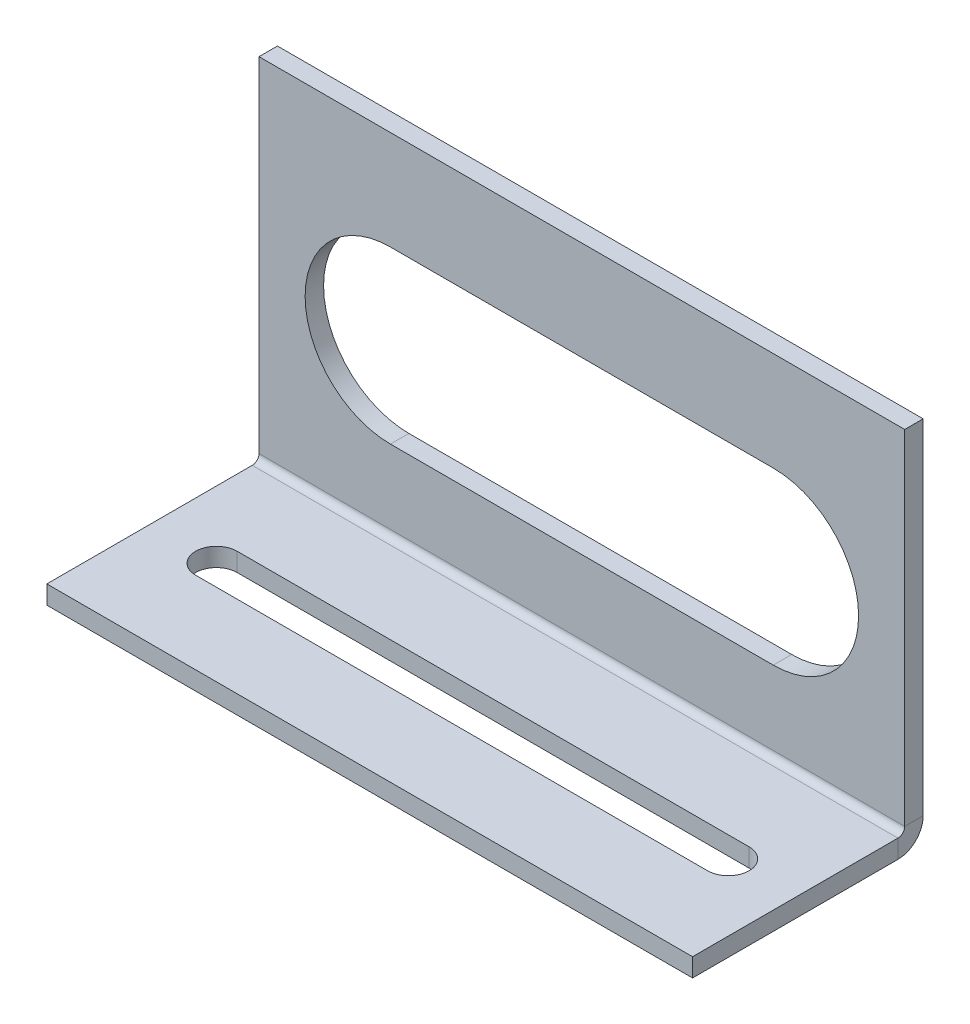
ISO-10303-21;
HEADER;
FILE_DESCRIPTION(('STEP AP214'),'2;1');
FILE_NAME('part.step','',(''),(''),'','','');
FILE_SCHEMA(('AUTOMOTIVE_DESIGN { 1 0 10303 214 1 1 1 1 }'));
ENDSEC;
DATA;
#1=APPLICATION_CONTEXT('core data for automotive mechanical design processes');
#2=APPLICATION_PROTOCOL_DEFINITION('international standard','automotive_design',2000,#1);
#3=PRODUCT_CONTEXT('',#1,'mechanical');
#4=PRODUCT('Part','Part','',(#3));
#5=PRODUCT_RELATED_PRODUCT_CATEGORY('part','',(#4));
#6=PRODUCT_DEFINITION_FORMATION('','',#4);
#7=PRODUCT_DEFINITION_CONTEXT('part definition',#1,'design');
#8=PRODUCT_DEFINITION('design','',#6,#7);
#9=PRODUCT_DEFINITION_SHAPE('','',#8);
#10=(LENGTH_UNIT() NAMED_UNIT(*) SI_UNIT(.MILLI.,.METRE.));
#11=(NAMED_UNIT(*) PLANE_ANGLE_UNIT() SI_UNIT($,.RADIAN.));
#12=(NAMED_UNIT(*) SI_UNIT($,.STERADIAN.) SOLID_ANGLE_UNIT());
#13=UNCERTAINTY_MEASURE_WITH_UNIT(LENGTH_MEASURE(1.E-05),#10,'distance_accuracy_value','');
#14=(GEOMETRIC_REPRESENTATION_CONTEXT(3) GLOBAL_UNCERTAINTY_ASSIGNED_CONTEXT((#13)) GLOBAL_UNIT_ASSIGNED_CONTEXT((#10,
#11,#12)) REPRESENTATION_CONTEXT('',''));
#15=CARTESIAN_POINT('',(0.,0.,0.));
#16=DIRECTION('',(0.,0.,1.));
#17=DIRECTION('',(1.,0.,0.));
#18=AXIS2_PLACEMENT_3D('',#15,#16,#17);
#19=CARTESIAN_POINT('',(0.,-18.,0.));
#20=DIRECTION('',(0.,1.,0.));
#21=DIRECTION('',(0.,0.,1.));
#22=AXIS2_PLACEMENT_3D('',#19,#20,#21);
#23=PLANE('',#22);
#24=DIRECTION('',(0.,0.,-1.));
#25=VECTOR('',#24,1.);
#26=CARTESIAN_POINT('',(35.,-18.0000000000001,23.));
#27=LINE('',#26,#25);
#28=CARTESIAN_POINT('',(35.,-18.,0.736599999999997));
#29=VERTEX_POINT('',#28);
#30=CARTESIAN_POINT('',(35.,-18.0000000000001,23.));
#31=VERTEX_POINT('',#30);
#32=EDGE_CURVE('E398',#29,#31,#27,.F.);
#33=ORIENTED_EDGE('',*,*,#32,.F.);
#34=DIRECTION('',(1.,0.,0.));
#35=VECTOR('',#34,1.);
#36=CARTESIAN_POINT('',(-35.,-18.,0.736599999999997));
#37=LINE('',#36,#35);
#38=CARTESIAN_POINT('',(-35.,-18.,0.736599999999997));
#39=VERTEX_POINT('',#38);
#40=EDGE_CURVE('E408',#39,#29,#37,.T.);
#41=ORIENTED_EDGE('',*,*,#40,.F.);
#42=DIRECTION('',(0.,0.,1.));
#43=VECTOR('',#42,1.);
#44=CARTESIAN_POINT('',(-35.,-18.,0.));
#45=LINE('',#44,#43);
#46=CARTESIAN_POINT('',(-35.,-18.0000000000001,23.));
#47=VERTEX_POINT('',#46);
#48=EDGE_CURVE('E400',#47,#39,#45,.F.);
#49=ORIENTED_EDGE('',*,*,#48,.F.);
#50=DIRECTION('',(1.,0.,0.));
#51=VECTOR('',#50,1.);
#52=CARTESIAN_POINT('',(-35.,-18.0000000000001,23.));
#53=LINE('',#52,#51);
#54=EDGE_CURVE('E396',#31,#47,#53,.F.);
#55=ORIENTED_EDGE('',*,*,#54,.F.);
#56=EDGE_LOOP('',(#33,#41,#49,#55));
#57=FACE_BOUND('',#56,.T.);
#58=CARTESIAN_POINT('',(-27.75,-18.,11.8683));
#59=DIRECTION('',(0.,1.,0.));
#60=DIRECTION('',(0.,0.,1.));
#61=AXIS2_PLACEMENT_3D('',#58,#59,#60);
#62=CIRCLE('',#61,2.25);
#63=CARTESIAN_POINT('',(-27.75,-18.,9.6183));
#64=VERTEX_POINT('',#63);
#65=CARTESIAN_POINT('',(-27.75,-18.,14.1183));
#66=VERTEX_POINT('',#65);
#67=EDGE_CURVE('E228',#64,#66,#62,.T.);
#68=ORIENTED_EDGE('',*,*,#67,.F.);
#69=DIRECTION('',(1.,0.,0.));
#70=VECTOR('',#69,1.);
#71=CARTESIAN_POINT('',(-27.75,-18.,9.6183));
#72=LINE('',#71,#70);
#73=CARTESIAN_POINT('',(27.75,-18.,9.6183));
#74=VERTEX_POINT('',#73);
#75=EDGE_CURVE('E318',#64,#74,#72,.T.);
#76=ORIENTED_EDGE('',*,*,#75,.T.);
#77=CARTESIAN_POINT('',(27.75,-18.,11.8683));
#78=DIRECTION('',(0.,1.,0.));
#79=DIRECTION('',(0.,0.,1.));
#80=AXIS2_PLACEMENT_3D('',#77,#78,#79);
#81=CIRCLE('',#80,2.25);
#82=CARTESIAN_POINT('',(27.75,-18.,14.1183));
#83=VERTEX_POINT('',#82);
#84=EDGE_CURVE('E333',#83,#74,#81,.T.);
#85=ORIENTED_EDGE('',*,*,#84,.F.);
#86=DIRECTION('',(1.,0.,0.));
#87=VECTOR('',#86,1.);
#88=CARTESIAN_POINT('',(-27.75,-18.,14.1183));
#89=LINE('',#88,#87);
#90=EDGE_CURVE('E337',#66,#83,#89,.T.);
#91=ORIENTED_EDGE('',*,*,#90,.F.);
#92=EDGE_LOOP('',(#68,#76,#85,#91));
#93=FACE_BOUND('',#92,.T.);
#94=ADVANCED_FACE('F205',(#57,#93),#23,.T.);
#95=CARTESIAN_POINT('',(35.,-20.,-2.));
#96=DIRECTION('',(1.,0.,0.));
#97=DIRECTION('',(0.,0.,-1.));
#98=AXIS2_PLACEMENT_3D('',#95,#96,#97);
#99=PLANE('',#98);
#100=DIRECTION('',(0.,1.,0.));
#101=VECTOR('',#100,1.);
#102=CARTESIAN_POINT('',(35.,-20.,0.));
#103=LINE('',#102,#101);
#104=CARTESIAN_POINT('',(35.,-17.2634,0.));
#105=VERTEX_POINT('',#104);
#106=CARTESIAN_POINT('',(35.,20.,0.));
#107=VERTEX_POINT('',#106);
#108=EDGE_CURVE('E432',#105,#107,#103,.T.);
#109=ORIENTED_EDGE('',*,*,#108,.F.);
#110=DIRECTION('',(0.,0.,-1.));
#111=VECTOR('',#110,1.);
#112=CARTESIAN_POINT('',(35.,-17.2634,0.));
#113=LINE('',#112,#111);
#114=CARTESIAN_POINT('',(35.,-17.2634,-2.));
#115=VERTEX_POINT('',#114);
#116=EDGE_CURVE('E419',#105,#115,#113,.T.);
#117=ORIENTED_EDGE('',*,*,#116,.T.);
#118=DIRECTION('',(0.,1.,0.));
#119=VECTOR('',#118,1.);
#120=CARTESIAN_POINT('',(35.,-20.,-2.));
#121=LINE('',#120,#119);
#122=CARTESIAN_POINT('',(35.,20.,-2.));
#123=VERTEX_POINT('',#122);
#124=EDGE_CURVE('E435',#115,#123,#121,.T.);
#125=ORIENTED_EDGE('',*,*,#124,.T.);
#126=DIRECTION('',(0.,0.,1.));
#127=VECTOR('',#126,1.);
#128=CARTESIAN_POINT('',(35.,20.,-2.));
#129=LINE('',#128,#127);
#130=EDGE_CURVE('E209',#123,#107,#129,.T.);
#131=ORIENTED_EDGE('',*,*,#130,.T.);
#132=EDGE_LOOP('',(#109,#117,#125,#131));
#133=FACE_BOUND('',#132,.T.);
#134=ADVANCED_FACE('F207',(#133),#99,.T.);
#135=CARTESIAN_POINT('',(0.,0.,-2.));
#136=DIRECTION('',(0.,0.,-1.));
#137=DIRECTION('',(-1.,0.,0.));
#138=AXIS2_PLACEMENT_3D('',#135,#136,#137);
#139=PLANE('',#138);
#140=CARTESIAN_POINT('',(-20.75,0.,-2.));
#141=DIRECTION('',(0.,0.,1.));
#142=DIRECTION('',(1.,0.,0.));
#143=AXIS2_PLACEMENT_3D('',#140,#141,#142);
#144=CIRCLE('',#143,9.25);
#145=CARTESIAN_POINT('',(-20.75,9.24999999999999,-2.));
#146=VERTEX_POINT('',#145);
#147=CARTESIAN_POINT('',(-20.75,-9.25,-2.));
#148=VERTEX_POINT('',#147);
#149=EDGE_CURVE('E361',#146,#148,#144,.T.);
#150=ORIENTED_EDGE('',*,*,#149,.T.);
#151=DIRECTION('',(1.,0.,0.));
#152=VECTOR('',#151,1.);
#153=CARTESIAN_POINT('',(-20.75,-9.25,-2.));
#154=LINE('',#153,#152);
#155=CARTESIAN_POINT('',(20.75,-9.25,-2.));
#156=VERTEX_POINT('',#155);
#157=EDGE_CURVE('E351',#148,#156,#154,.T.);
#158=ORIENTED_EDGE('',*,*,#157,.T.);
#159=CARTESIAN_POINT('',(20.75,0.,-2.));
#160=DIRECTION('',(0.,0.,1.));
#161=DIRECTION('',(1.,0.,0.));
#162=AXIS2_PLACEMENT_3D('',#159,#160,#161);
#163=CIRCLE('',#162,9.25);
#164=CARTESIAN_POINT('',(20.75,9.25,-2.));
#165=VERTEX_POINT('',#164);
#166=EDGE_CURVE('E373',#156,#165,#163,.T.);
#167=ORIENTED_EDGE('',*,*,#166,.T.);
#168=DIRECTION('',(1.,0.,0.));
#169=VECTOR('',#168,1.);
#170=CARTESIAN_POINT('',(-20.75,9.24999999999999,-2.));
#171=LINE('',#170,#169);
#172=EDGE_CURVE('E354',#146,#165,#171,.T.);
#173=ORIENTED_EDGE('',*,*,#172,.F.);
#174=EDGE_LOOP('',(#150,#158,#167,#173));
#175=FACE_BOUND('',#174,.T.);
#176=ORIENTED_EDGE('',*,*,#124,.F.);
#177=DIRECTION('',(1.,0.,0.));
#178=VECTOR('',#177,1.);
#179=CARTESIAN_POINT('',(35.,-17.2634,-2.));
#180=LINE('',#179,#178);
#181=CARTESIAN_POINT('',(-35.,-17.2634,-2.));
#182=VERTEX_POINT('',#181);
#183=EDGE_CURVE('E412',#115,#182,#180,.F.);
#184=ORIENTED_EDGE('',*,*,#183,.T.);
#185=DIRECTION('',(0.,-1.,0.));
#186=VECTOR('',#185,1.);
#187=CARTESIAN_POINT('',(-35.,-20.,-2.));
#188=LINE('',#187,#186);
#189=CARTESIAN_POINT('',(-35.,20.,-2.));
#190=VERTEX_POINT('',#189);
#191=EDGE_CURVE('E441',#190,#182,#188,.T.);
#192=ORIENTED_EDGE('',*,*,#191,.F.);
#193=DIRECTION('',(-1.,0.,0.));
#194=VECTOR('',#193,1.);
#195=CARTESIAN_POINT('',(-35.,20.,-2.));
#196=LINE('',#195,#194);
#197=EDGE_CURVE('E437',#123,#190,#196,.T.);
#198=ORIENTED_EDGE('',*,*,#197,.F.);
#199=EDGE_LOOP('',(#176,#184,#192,#198));
#200=FACE_BOUND('',#199,.T.);
#201=ADVANCED_FACE('F464',(#175,#200),#139,.T.);
#202=CARTESIAN_POINT('',(0.,0.,0.));
#203=DIRECTION('',(0.,0.,-1.));
#204=DIRECTION('',(-1.,0.,0.));
#205=AXIS2_PLACEMENT_3D('',#202,#203,#204);
#206=PLANE('',#205);
#207=CARTESIAN_POINT('',(-20.75,0.,0.));
#208=DIRECTION('',(0.,0.,1.));
#209=DIRECTION('',(1.,0.,0.));
#210=AXIS2_PLACEMENT_3D('',#207,#208,#209);
#211=CIRCLE('',#210,9.24999999999999);
#212=CARTESIAN_POINT('',(-20.75,9.24999999999998,0.));
#213=VERTEX_POINT('',#212);
#214=CARTESIAN_POINT('',(-20.75,-9.25,0.));
#215=VERTEX_POINT('',#214);
#216=EDGE_CURVE('E359',#213,#215,#211,.T.);
#217=ORIENTED_EDGE('',*,*,#216,.F.);
#218=DIRECTION('',(1.,0.,0.));
#219=VECTOR('',#218,1.);
#220=CARTESIAN_POINT('',(-20.75,9.24999999999998,0.));
#221=LINE('',#220,#219);
#222=CARTESIAN_POINT('',(20.75,9.24999999999999,0.));
#223=VERTEX_POINT('',#222);
#224=EDGE_CURVE('E356',#213,#223,#221,.T.);
#225=ORIENTED_EDGE('',*,*,#224,.T.);
#226=CARTESIAN_POINT('',(20.75,0.,0.));
#227=DIRECTION('',(0.,0.,1.));
#228=DIRECTION('',(1.,0.,0.));
#229=AXIS2_PLACEMENT_3D('',#226,#227,#228);
#230=CIRCLE('',#229,9.24999999999999);
#231=CARTESIAN_POINT('',(20.75,-9.25000000000004,0.));
#232=VERTEX_POINT('',#231);
#233=EDGE_CURVE('E370',#232,#223,#230,.T.);
#234=ORIENTED_EDGE('',*,*,#233,.F.);
#235=DIRECTION('',(1.,0.,0.));
#236=VECTOR('',#235,1.);
#237=CARTESIAN_POINT('',(-20.75,-9.25000000000004,0.));
#238=LINE('',#237,#236);
#239=EDGE_CURVE('E349',#215,#232,#238,.T.);
#240=ORIENTED_EDGE('',*,*,#239,.F.);
#241=EDGE_LOOP('',(#217,#225,#234,#240));
#242=FACE_BOUND('',#241,.T.);
#243=DIRECTION('',(1.,0.,0.));
#244=VECTOR('',#243,1.);
#245=CARTESIAN_POINT('',(35.,-17.2634,0.));
#246=LINE('',#245,#244);
#247=CARTESIAN_POINT('',(-35.,-17.2634,0.));
#248=VERTEX_POINT('',#247);
#249=EDGE_CURVE('E425',#105,#248,#246,.F.);
#250=ORIENTED_EDGE('',*,*,#249,.F.);
#251=ORIENTED_EDGE('',*,*,#108,.T.);
#252=DIRECTION('',(-1.,0.,0.));
#253=VECTOR('',#252,1.);
#254=CARTESIAN_POINT('',(-35.,20.,0.));
#255=LINE('',#254,#253);
#256=CARTESIAN_POINT('',(-35.,20.,0.));
#257=VERTEX_POINT('',#256);
#258=EDGE_CURVE('E445',#107,#257,#255,.T.);
#259=ORIENTED_EDGE('',*,*,#258,.T.);
#260=DIRECTION('',(0.,-1.,0.));
#261=VECTOR('',#260,1.);
#262=CARTESIAN_POINT('',(-35.,-20.,0.));
#263=LINE('',#262,#261);
#264=EDGE_CURVE('E438',#257,#248,#263,.T.);
#265=ORIENTED_EDGE('',*,*,#264,.T.);
#266=EDGE_LOOP('',(#250,#251,#259,#265));
#267=FACE_BOUND('',#266,.T.);
#268=ADVANCED_FACE('F453',(#242,#267),#206,.F.);
#269=CARTESIAN_POINT('',(-35.,-20.,-2.));
#270=DIRECTION('',(-1.,0.,0.));
#271=DIRECTION('',(0.,0.,1.));
#272=AXIS2_PLACEMENT_3D('',#269,#270,#271);
#273=PLANE('',#272);
#274=DIRECTION('',(0.,0.,-1.));
#275=VECTOR('',#274,1.);
#276=CARTESIAN_POINT('',(-35.,-17.2634,0.));
#277=LINE('',#276,#275);
#278=EDGE_CURVE('E429',#248,#182,#277,.T.);
#279=ORIENTED_EDGE('',*,*,#278,.F.);
#280=ORIENTED_EDGE('',*,*,#264,.F.);
#281=DIRECTION('',(0.,0.,1.));
#282=VECTOR('',#281,1.);
#283=CARTESIAN_POINT('',(-35.,20.,-2.));
#284=LINE('',#283,#282);
#285=EDGE_CURVE('E14',#190,#257,#284,.T.);
#286=ORIENTED_EDGE('',*,*,#285,.F.);
#287=ORIENTED_EDGE('',*,*,#191,.T.);
#288=EDGE_LOOP('',(#279,#280,#286,#287));
#289=FACE_BOUND('',#288,.T.);
#290=ADVANCED_FACE('F457',(#289),#273,.T.);
#291=CARTESIAN_POINT('',(-35.,20.,-2.));
#292=DIRECTION('',(0.,1.,0.));
#293=DIRECTION('',(0.,0.,1.));
#294=AXIS2_PLACEMENT_3D('',#291,#292,#293);
#295=PLANE('',#294);
#296=ORIENTED_EDGE('',*,*,#258,.F.);
#297=ORIENTED_EDGE('',*,*,#130,.F.);
#298=ORIENTED_EDGE('',*,*,#197,.T.);
#299=ORIENTED_EDGE('',*,*,#285,.T.);
#300=EDGE_LOOP('',(#296,#297,#298,#299));
#301=FACE_BOUND('',#300,.T.);
#302=ADVANCED_FACE('F477',(#301),#295,.T.);
#303=CARTESIAN_POINT('',(-35.,-17.2634,0.7366));
#304=DIRECTION('',(-1.,0.,0.));
#305=DIRECTION('',(0.,0.,1.));
#306=AXIS2_PLACEMENT_3D('',#303,#304,#305);
#307=PLANE('',#306);
#308=DIRECTION('',(0.,1.,0.));
#309=VECTOR('',#308,1.);
#310=CARTESIAN_POINT('',(-35.,-20.,0.73659999999999));
#311=LINE('',#310,#309);
#312=CARTESIAN_POINT('',(-35.,-20.,0.73659999999999));
#313=VERTEX_POINT('',#312);
#314=EDGE_CURVE('E381',#39,#313,#311,.F.);
#315=ORIENTED_EDGE('',*,*,#314,.F.);
#316=CARTESIAN_POINT('',(-35.,-17.2634,0.7366));
#317=DIRECTION('',(1.,0.,0.));
#318=DIRECTION('',(0.,0.,-1.));
#319=AXIS2_PLACEMENT_3D('',#316,#317,#318);
#320=CIRCLE('',#319,0.7366);
#321=EDGE_CURVE('E422',#248,#39,#320,.F.);
#322=ORIENTED_EDGE('',*,*,#321,.F.);
#323=ORIENTED_EDGE('',*,*,#278,.T.);
#324=CARTESIAN_POINT('',(-35.,-17.2634,0.7366));
#325=DIRECTION('',(1.,0.,0.));
#326=DIRECTION('',(0.,0.,-1.));
#327=AXIS2_PLACEMENT_3D('',#324,#325,#326);
#328=CIRCLE('',#327,2.7366);
#329=EDGE_CURVE('E415',#182,#313,#328,.F.);
#330=ORIENTED_EDGE('',*,*,#329,.T.);
#331=EDGE_LOOP('',(#315,#322,#323,#330));
#332=FACE_BOUND('',#331,.T.);
#333=ADVANCED_FACE('F461',(#332),#307,.T.);
#334=CARTESIAN_POINT('',(35.,-17.2634,0.7366));
#335=DIRECTION('',(-1.,0.,0.));
#336=DIRECTION('',(0.,0.,1.));
#337=AXIS2_PLACEMENT_3D('',#334,#335,#336);
#338=PLANE('',#337);
#339=CARTESIAN_POINT('',(35.,-17.2634,0.7366));
#340=DIRECTION('',(1.,0.,0.));
#341=DIRECTION('',(0.,0.,-1.));
#342=AXIS2_PLACEMENT_3D('',#339,#340,#341);
#343=CIRCLE('',#342,0.7366);
#344=EDGE_CURVE('E385',#29,#105,#343,.T.);
#345=ORIENTED_EDGE('',*,*,#344,.F.);
#346=DIRECTION('',(0.,1.,0.));
#347=VECTOR('',#346,1.);
#348=CARTESIAN_POINT('',(35.,-18.,0.736599999999997));
#349=LINE('',#348,#347);
#350=CARTESIAN_POINT('',(35.,-20.,0.73659999999999));
#351=VERTEX_POINT('',#350);
#352=EDGE_CURVE('E405',#29,#351,#349,.F.);
#353=ORIENTED_EDGE('',*,*,#352,.T.);
#354=CARTESIAN_POINT('',(35.,-17.2634,0.7366));
#355=DIRECTION('',(1.,0.,0.));
#356=DIRECTION('',(0.,0.,-1.));
#357=AXIS2_PLACEMENT_3D('',#354,#355,#356);
#358=CIRCLE('',#357,2.7366);
#359=EDGE_CURVE('E416',#351,#115,#358,.T.);
#360=ORIENTED_EDGE('',*,*,#359,.T.);
#361=ORIENTED_EDGE('',*,*,#116,.F.);
#362=EDGE_LOOP('',(#345,#353,#360,#361));
#363=FACE_BOUND('',#362,.T.);
#364=ADVANCED_FACE('F470',(#363),#338,.F.);
#365=CARTESIAN_POINT('',(35.,-17.2634,0.7366));
#366=DIRECTION('',(1.,0.,0.));
#367=DIRECTION('',(0.,-1.,0.));
#368=AXIS2_PLACEMENT_3D('',#365,#366,#367);
#369=CYLINDRICAL_SURFACE('',#368,2.7366);
#370=ORIENTED_EDGE('',*,*,#183,.F.);
#371=ORIENTED_EDGE('',*,*,#359,.F.);
#372=DIRECTION('',(1.,0.,0.));
#373=VECTOR('',#372,1.);
#374=CARTESIAN_POINT('',(-35.,-20.,0.73659999999999));
#375=LINE('',#374,#373);
#376=EDGE_CURVE('E403',#351,#313,#375,.F.);
#377=ORIENTED_EDGE('',*,*,#376,.T.);
#378=ORIENTED_EDGE('',*,*,#329,.F.);
#379=EDGE_LOOP('',(#370,#371,#377,#378));
#380=FACE_BOUND('',#379,.T.);
#381=ADVANCED_FACE('F467',(#380),#369,.T.);
#382=CARTESIAN_POINT('',(35.,-17.2634,0.7366));
#383=DIRECTION('',(1.,0.,0.));
#384=DIRECTION('',(0.,-1.,0.));
#385=AXIS2_PLACEMENT_3D('',#382,#383,#384);
#386=CYLINDRICAL_SURFACE('',#385,0.7366);
#387=ORIENTED_EDGE('',*,*,#249,.T.);
#388=ORIENTED_EDGE('',*,*,#321,.T.);
#389=ORIENTED_EDGE('',*,*,#40,.T.);
#390=ORIENTED_EDGE('',*,*,#344,.T.);
#391=EDGE_LOOP('',(#387,#388,#389,#390));
#392=FACE_BOUND('',#391,.T.);
#393=ADVANCED_FACE('F508',(#392),#386,.F.);
#394=CARTESIAN_POINT('',(-35.,-20.,0.));
#395=DIRECTION('',(1.,0.,0.));
#396=DIRECTION('',(0.,0.,-1.));
#397=AXIS2_PLACEMENT_3D('',#394,#395,#396);
#398=PLANE('',#397);
#399=ORIENTED_EDGE('',*,*,#314,.T.);
#400=DIRECTION('',(0.,0.,-1.));
#401=VECTOR('',#400,1.);
#402=CARTESIAN_POINT('',(-35.,-20.,0.));
#403=LINE('',#402,#401);
#404=CARTESIAN_POINT('',(-35.,-20.0000000000001,23.));
#405=VERTEX_POINT('',#404);
#406=EDGE_CURVE('E393',#405,#313,#403,.T.);
#407=ORIENTED_EDGE('',*,*,#406,.F.);
#408=DIRECTION('',(0.,1.,0.));
#409=VECTOR('',#408,1.);
#410=CARTESIAN_POINT('',(-35.,-20.0000000000001,23.));
#411=LINE('',#410,#409);
#412=EDGE_CURVE('E386',#405,#47,#411,.T.);
#413=ORIENTED_EDGE('',*,*,#412,.T.);
#414=ORIENTED_EDGE('',*,*,#48,.T.);
#415=EDGE_LOOP('',(#399,#407,#413,#414));
#416=FACE_BOUND('',#415,.T.);
#417=ADVANCED_FACE('F504',(#416),#398,.F.);
#418=CARTESIAN_POINT('',(35.,-20.0000000000001,23.));
#419=DIRECTION('',(-1.,0.,0.));
#420=DIRECTION('',(0.,0.,1.));
#421=AXIS2_PLACEMENT_3D('',#418,#419,#420);
#422=PLANE('',#421);
#423=ORIENTED_EDGE('',*,*,#352,.F.);
#424=ORIENTED_EDGE('',*,*,#32,.T.);
#425=DIRECTION('',(0.,1.,0.));
#426=VECTOR('',#425,1.);
#427=CARTESIAN_POINT('',(35.,-20.0000000000001,23.));
#428=LINE('',#427,#426);
#429=CARTESIAN_POINT('',(35.,-20.0000000000001,23.));
#430=VERTEX_POINT('',#429);
#431=EDGE_CURVE('E382',#430,#31,#428,.T.);
#432=ORIENTED_EDGE('',*,*,#431,.F.);
#433=DIRECTION('',(0.,0.,1.));
#434=VECTOR('',#433,1.);
#435=CARTESIAN_POINT('',(35.,-20.,0.));
#436=LINE('',#435,#434);
#437=EDGE_CURVE('E391',#351,#430,#436,.T.);
#438=ORIENTED_EDGE('',*,*,#437,.F.);
#439=EDGE_LOOP('',(#423,#424,#432,#438));
#440=FACE_BOUND('',#439,.T.);
#441=ADVANCED_FACE('F501',(#440),#422,.F.);
#442=CARTESIAN_POINT('',(0.,-20.,0.));
#443=DIRECTION('',(0.,1.,0.));
#444=DIRECTION('',(0.,0.,1.));
#445=AXIS2_PLACEMENT_3D('',#442,#443,#444);
#446=PLANE('',#445);
#447=DIRECTION('',(1.,0.,0.));
#448=VECTOR('',#447,1.);
#449=CARTESIAN_POINT('',(-27.75,-20.0000000000001,9.6183));
#450=LINE('',#449,#448);
#451=CARTESIAN_POINT('',(-27.75,-20.0000000000001,9.6183));
#452=VERTEX_POINT('',#451);
#453=CARTESIAN_POINT('',(27.75,-20.0000000000001,9.6183));
#454=VERTEX_POINT('',#453);
#455=EDGE_CURVE('E327',#452,#454,#450,.T.);
#456=ORIENTED_EDGE('',*,*,#455,.F.);
#457=CARTESIAN_POINT('',(-27.75,-20.0000000000001,11.8683));
#458=DIRECTION('',(0.,1.,0.));
#459=DIRECTION('',(0.,0.,1.));
#460=AXIS2_PLACEMENT_3D('',#457,#458,#459);
#461=CIRCLE('',#460,2.25);
#462=CARTESIAN_POINT('',(-27.75,-20.0000000000001,14.1183));
#463=VERTEX_POINT('',#462);
#464=EDGE_CURVE('E331',#452,#463,#461,.T.);
#465=ORIENTED_EDGE('',*,*,#464,.T.);
#466=DIRECTION('',(1.,0.,0.));
#467=VECTOR('',#466,1.);
#468=CARTESIAN_POINT('',(-27.75,-20.0000000000001,14.1183));
#469=LINE('',#468,#467);
#470=CARTESIAN_POINT('',(27.75,-20.,14.1183));
#471=VERTEX_POINT('',#470);
#472=EDGE_CURVE('E723',#463,#471,#469,.T.);
#473=ORIENTED_EDGE('',*,*,#472,.T.);
#474=CARTESIAN_POINT('',(27.75,-20.0000000000001,11.8683));
#475=DIRECTION('',(0.,1.,0.));
#476=DIRECTION('',(0.,0.,1.));
#477=AXIS2_PLACEMENT_3D('',#474,#475,#476);
#478=CIRCLE('',#477,2.25);
#479=EDGE_CURVE('E344',#471,#454,#478,.T.);
#480=ORIENTED_EDGE('',*,*,#479,.T.);
#481=EDGE_LOOP('',(#456,#465,#473,#480));
#482=FACE_BOUND('',#481,.T.);
#483=ORIENTED_EDGE('',*,*,#376,.F.);
#484=ORIENTED_EDGE('',*,*,#437,.T.);
#485=DIRECTION('',(-1.,0.,0.));
#486=VECTOR('',#485,1.);
#487=CARTESIAN_POINT('',(0.,-20.0000000000001,23.));
#488=LINE('',#487,#486);
#489=EDGE_CURVE('E389',#430,#405,#488,.T.);
#490=ORIENTED_EDGE('',*,*,#489,.T.);
#491=ORIENTED_EDGE('',*,*,#406,.T.);
#492=EDGE_LOOP('',(#483,#484,#490,#491));
#493=FACE_BOUND('',#492,.T.);
#494=ADVANCED_FACE('F494',(#482,#493),#446,.F.);
#495=CARTESIAN_POINT('',(-35.,-20.0000000000001,23.));
#496=DIRECTION('',(0.,0.,-1.));
#497=DIRECTION('',(0.,1.,0.));
#498=AXIS2_PLACEMENT_3D('',#495,#496,#497);
#499=PLANE('',#498);
#500=ORIENTED_EDGE('',*,*,#54,.T.);
#501=ORIENTED_EDGE('',*,*,#412,.F.);
#502=ORIENTED_EDGE('',*,*,#489,.F.);
#503=ORIENTED_EDGE('',*,*,#431,.T.);
#504=EDGE_LOOP('',(#500,#501,#502,#503));
#505=FACE_BOUND('',#504,.T.);
#506=ADVANCED_FACE('F496',(#505),#499,.F.);
#507=CARTESIAN_POINT('',(20.75,0.,0.));
#508=DIRECTION('',(0.,0.,1.));
#509=DIRECTION('',(1.,0.,0.));
#510=AXIS2_PLACEMENT_3D('',#507,#508,#509);
#511=CYLINDRICAL_SURFACE('',#510,9.24999999999999);
#512=ORIENTED_EDGE('',*,*,#166,.F.);
#513=DIRECTION('',(0.,0.,1.));
#514=VECTOR('',#513,1.);
#515=CARTESIAN_POINT('',(20.75,-9.24999999999999,0.));
#516=LINE('',#515,#514);
#517=EDGE_CURVE('E378',#232,#156,#516,.F.);
#518=ORIENTED_EDGE('',*,*,#517,.F.);
#519=ORIENTED_EDGE('',*,*,#233,.T.);
#520=DIRECTION('',(0.,0.,1.));
#521=VECTOR('',#520,1.);
#522=CARTESIAN_POINT('',(20.75,9.25,0.));
#523=LINE('',#522,#521);
#524=EDGE_CURVE('E376',#165,#223,#523,.T.);
#525=ORIENTED_EDGE('',*,*,#524,.F.);
#526=EDGE_LOOP('',(#512,#518,#519,#525));
#527=FACE_BOUND('',#526,.T.);
#528=ADVANCED_FACE('F499',(#527),#511,.F.);
#529=CARTESIAN_POINT('',(-20.75,0.,0.));
#530=DIRECTION('',(0.,0.,1.));
#531=DIRECTION('',(1.,0.,0.));
#532=AXIS2_PLACEMENT_3D('',#529,#530,#531);
#533=CYLINDRICAL_SURFACE('',#532,9.24999999999999);
#534=ORIENTED_EDGE('',*,*,#216,.T.);
#535=DIRECTION('',(0.,0.,1.));
#536=VECTOR('',#535,1.);
#537=CARTESIAN_POINT('',(-20.75,-9.25,0.));
#538=LINE('',#537,#536);
#539=EDGE_CURVE('E364',#148,#215,#538,.T.);
#540=ORIENTED_EDGE('',*,*,#539,.F.);
#541=ORIENTED_EDGE('',*,*,#149,.F.);
#542=DIRECTION('',(0.,0.,1.));
#543=VECTOR('',#542,1.);
#544=CARTESIAN_POINT('',(-20.75,9.24999999999999,0.));
#545=LINE('',#544,#543);
#546=EDGE_CURVE('E367',#213,#146,#545,.F.);
#547=ORIENTED_EDGE('',*,*,#546,.F.);
#548=EDGE_LOOP('',(#534,#540,#541,#547));
#549=FACE_BOUND('',#548,.T.);
#550=ADVANCED_FACE('F530',(#549),#533,.F.);
#551=CARTESIAN_POINT('',(-20.75,9.24999999999999,0.));
#552=DIRECTION('',(0.,1.,0.));
#553=DIRECTION('',(-1.,0.,0.));
#554=AXIS2_PLACEMENT_3D('',#551,#552,#553);
#555=PLANE('',#554);
#556=ORIENTED_EDGE('',*,*,#524,.T.);
#557=ORIENTED_EDGE('',*,*,#224,.F.);
#558=ORIENTED_EDGE('',*,*,#546,.T.);
#559=ORIENTED_EDGE('',*,*,#172,.T.);
#560=EDGE_LOOP('',(#556,#557,#558,#559));
#561=FACE_BOUND('',#560,.T.);
#562=ADVANCED_FACE('F536',(#561),#555,.F.);
#563=CARTESIAN_POINT('',(-20.75,-9.25,0.));
#564=DIRECTION('',(0.,-1.,0.));
#565=DIRECTION('',(1.,0.,0.));
#566=AXIS2_PLACEMENT_3D('',#563,#564,#565);
#567=PLANE('',#566);
#568=ORIENTED_EDGE('',*,*,#517,.T.);
#569=ORIENTED_EDGE('',*,*,#157,.F.);
#570=ORIENTED_EDGE('',*,*,#539,.T.);
#571=ORIENTED_EDGE('',*,*,#239,.T.);
#572=EDGE_LOOP('',(#568,#569,#570,#571));
#573=FACE_BOUND('',#572,.T.);
#574=ADVANCED_FACE('F532',(#573),#567,.F.);
#575=CARTESIAN_POINT('',(27.75,-18.,11.8683));
#576=DIRECTION('',(0.,1.,0.));
#577=DIRECTION('',(0.,0.,1.));
#578=AXIS2_PLACEMENT_3D('',#575,#576,#577);
#579=CYLINDRICAL_SURFACE('',#578,2.25);
#580=ORIENTED_EDGE('',*,*,#479,.F.);
#581=DIRECTION('',(0.,1.,0.));
#582=VECTOR('',#581,1.);
#583=CARTESIAN_POINT('',(27.75,-18.,14.1183));
#584=LINE('',#583,#582);
#585=EDGE_CURVE('E220',#83,#471,#584,.F.);
#586=ORIENTED_EDGE('',*,*,#585,.F.);
#587=ORIENTED_EDGE('',*,*,#84,.T.);
#588=DIRECTION('',(0.,1.,0.));
#589=VECTOR('',#588,1.);
#590=CARTESIAN_POINT('',(27.75,-18.,9.6183));
#591=LINE('',#590,#589);
#592=EDGE_CURVE('E323',#454,#74,#591,.T.);
#593=ORIENTED_EDGE('',*,*,#592,.F.);
#594=EDGE_LOOP('',(#580,#586,#587,#593));
#595=FACE_BOUND('',#594,.T.);
#596=ADVANCED_FACE('F549',(#595),#579,.F.);
#597=CARTESIAN_POINT('',(-27.75,-18.,11.8683));
#598=DIRECTION('',(0.,1.,0.));
#599=DIRECTION('',(0.,0.,1.));
#600=AXIS2_PLACEMENT_3D('',#597,#598,#599);
#601=CYLINDRICAL_SURFACE('',#600,2.25);
#602=ORIENTED_EDGE('',*,*,#67,.T.);
#603=DIRECTION('',(0.,1.,0.));
#604=VECTOR('',#603,1.);
#605=CARTESIAN_POINT('',(-27.75,-18.,14.1183));
#606=LINE('',#605,#604);
#607=EDGE_CURVE('E334',#463,#66,#606,.T.);
#608=ORIENTED_EDGE('',*,*,#607,.F.);
#609=ORIENTED_EDGE('',*,*,#464,.F.);
#610=DIRECTION('',(0.,1.,0.));
#611=VECTOR('',#610,1.);
#612=CARTESIAN_POINT('',(-27.75,-18.,9.6183));
#613=LINE('',#612,#611);
#614=EDGE_CURVE('E320',#64,#452,#613,.F.);
#615=ORIENTED_EDGE('',*,*,#614,.F.);
#616=EDGE_LOOP('',(#602,#608,#609,#615));
#617=FACE_BOUND('',#616,.T.);
#618=ADVANCED_FACE('F329',(#617),#601,.F.);
#619=CARTESIAN_POINT('',(-27.75,-18.,9.6183));
#620=DIRECTION('',(0.,0.,-1.));
#621=DIRECTION('',(0.,1.,0.));
#622=AXIS2_PLACEMENT_3D('',#619,#620,#621);
#623=PLANE('',#622);
#624=ORIENTED_EDGE('',*,*,#592,.T.);
#625=ORIENTED_EDGE('',*,*,#75,.F.);
#626=ORIENTED_EDGE('',*,*,#614,.T.);
#627=ORIENTED_EDGE('',*,*,#455,.T.);
#628=EDGE_LOOP('',(#624,#625,#626,#627));
#629=FACE_BOUND('',#628,.T.);
#630=ADVANCED_FACE('F319',(#629),#623,.F.);
#631=CARTESIAN_POINT('',(-27.75,-18.,14.1183));
#632=DIRECTION('',(0.,0.,1.));
#633=DIRECTION('',(0.,-1.,0.));
#634=AXIS2_PLACEMENT_3D('',#631,#632,#633);
#635=PLANE('',#634);
#636=ORIENTED_EDGE('',*,*,#585,.T.);
#637=ORIENTED_EDGE('',*,*,#472,.F.);
#638=ORIENTED_EDGE('',*,*,#607,.T.);
#639=ORIENTED_EDGE('',*,*,#90,.T.);
#640=EDGE_LOOP('',(#636,#637,#638,#639));
#641=FACE_BOUND('',#640,.T.);
#642=ADVANCED_FACE('F557',(#641),#635,.F.);
#643=CLOSED_SHELL('',(#94,#134,#201,#268,#290,#302,#333,#364,#381,#393,#417,#441,#494,#506,#528,
#550,#562,#574,#596,#618,#630,#642));
#644=MANIFOLD_SOLID_BREP('B2',#643);
#645=ADVANCED_BREP_SHAPE_REPRESENTATION('',(#18,#644),#14);
#646=SHAPE_DEFINITION_REPRESENTATION(#9,#645);
ENDSEC;
END-ISO-10303-21;
